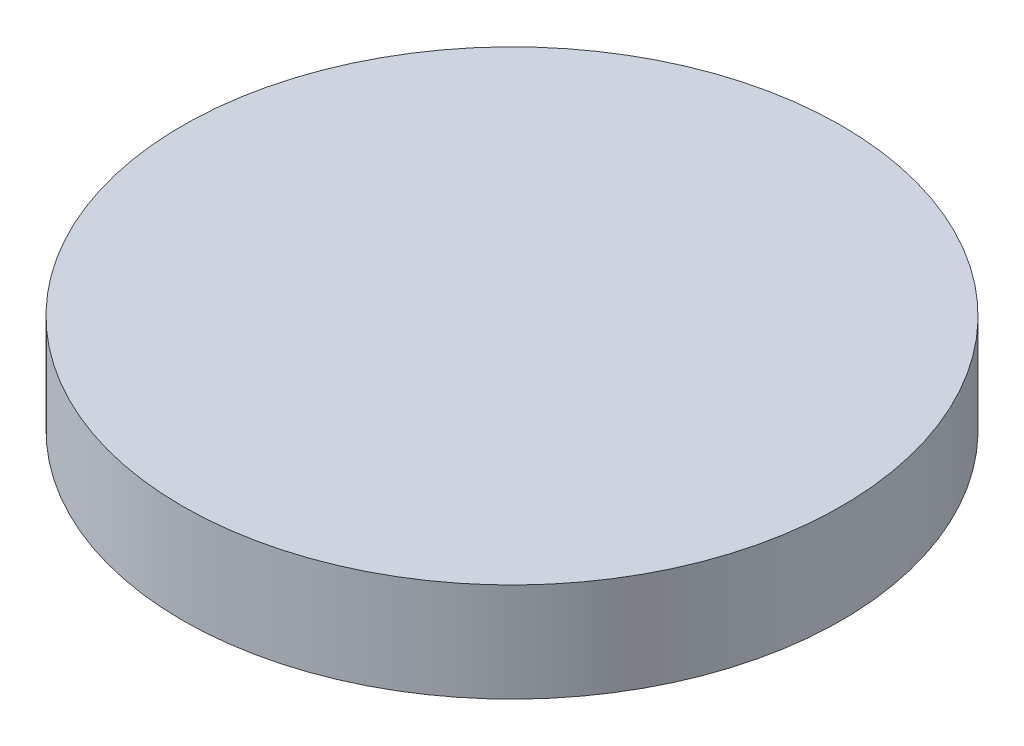
ISO-10303-21;
HEADER;
FILE_DESCRIPTION(('STEP AP214'),'2;1');
FILE_NAME('part.step','',(''),(''),'','','');
FILE_SCHEMA(('AUTOMOTIVE_DESIGN { 1 0 10303 214 1 1 1 1 }'));
ENDSEC;
DATA;
#1=APPLICATION_CONTEXT('core data for automotive mechanical design processes');
#2=APPLICATION_PROTOCOL_DEFINITION('international standard','automotive_design',2000,#1);
#3=PRODUCT_CONTEXT('',#1,'mechanical');
#4=PRODUCT('Part','Part','',(#3));
#5=PRODUCT_RELATED_PRODUCT_CATEGORY('part','',(#4));
#6=PRODUCT_DEFINITION_FORMATION('','',#4);
#7=PRODUCT_DEFINITION_CONTEXT('part definition',#1,'design');
#8=PRODUCT_DEFINITION('design','',#6,#7);
#9=PRODUCT_DEFINITION_SHAPE('','',#8);
#10=(LENGTH_UNIT() NAMED_UNIT(*) SI_UNIT(.MILLI.,.METRE.));
#11=(NAMED_UNIT(*) PLANE_ANGLE_UNIT() SI_UNIT($,.RADIAN.));
#12=(NAMED_UNIT(*) SI_UNIT($,.STERADIAN.) SOLID_ANGLE_UNIT());
#13=UNCERTAINTY_MEASURE_WITH_UNIT(LENGTH_MEASURE(1.E-05),#10,'distance_accuracy_value','');
#14=(GEOMETRIC_REPRESENTATION_CONTEXT(3) GLOBAL_UNCERTAINTY_ASSIGNED_CONTEXT((#13)) GLOBAL_UNIT_ASSIGNED_CONTEXT((#10,
#11,#12)) REPRESENTATION_CONTEXT('',''));
#15=CARTESIAN_POINT('',(0.,0.,0.));
#16=DIRECTION('',(0.,0.,1.));
#17=DIRECTION('',(1.,0.,0.));
#18=AXIS2_PLACEMENT_3D('',#15,#16,#17);
#19=CARTESIAN_POINT('',(0.,3.,0.));
#20=DIRECTION('',(0.,-1.,0.));
#21=DIRECTION('',(0.,0.,-1.));
#22=AXIS2_PLACEMENT_3D('',#19,#20,#21);
#23=CYLINDRICAL_SURFACE('',#22,10.);
#24=CARTESIAN_POINT('',(0.,3.,0.));
#25=DIRECTION('',(0.,1.,0.));
#26=DIRECTION('',(0.,0.,1.));
#27=AXIS2_PLACEMENT_3D('',#24,#25,#26);
#28=CIRCLE('',#27,10.);
#29=CARTESIAN_POINT('',(0.,3.,10.));
#30=VERTEX_POINT('',#29);
#31=EDGE_CURVE('E10',#30,#30,#28,.T.);
#32=ORIENTED_EDGE('',*,*,#31,.F.);
#33=EDGE_LOOP('',(#32));
#34=FACE_BOUND('',#33,.T.);
#35=CARTESIAN_POINT('',(0.,0.,0.));
#36=DIRECTION('',(0.,1.,0.));
#37=DIRECTION('',(0.,0.,1.));
#38=AXIS2_PLACEMENT_3D('',#35,#36,#37);
#39=CIRCLE('',#38,10.);
#40=CARTESIAN_POINT('',(0.,0.,10.));
#41=VERTEX_POINT('',#40);
#42=EDGE_CURVE('E44',#41,#41,#39,.T.);
#43=ORIENTED_EDGE('',*,*,#42,.T.);
#44=EDGE_LOOP('',(#43));
#45=FACE_BOUND('',#44,.T.);
#46=ADVANCED_FACE('F41',(#34,#45),#23,.T.);
#47=CARTESIAN_POINT('',(0.,3.,0.));
#48=DIRECTION('',(0.,1.,0.));
#49=DIRECTION('',(0.,0.,1.));
#50=AXIS2_PLACEMENT_3D('',#47,#48,#49);
#51=PLANE('',#50);
#52=ORIENTED_EDGE('',*,*,#31,.T.);
#53=EDGE_LOOP('',(#52));
#54=FACE_BOUND('',#53,.T.);
#55=ADVANCED_FACE('F58',(#54),#51,.T.);
#56=CARTESIAN_POINT('',(0.,0.,0.));
#57=DIRECTION('',(0.,1.,0.));
#58=DIRECTION('',(0.,0.,1.));
#59=AXIS2_PLACEMENT_3D('',#56,#57,#58);
#60=PLANE('',#59);
#61=ORIENTED_EDGE('',*,*,#42,.F.);
#62=EDGE_LOOP('',(#61));
#63=FACE_BOUND('',#62,.T.);
#64=ADVANCED_FACE('F56',(#63),#60,.F.);
#65=CLOSED_SHELL('',(#46,#55,#64));
#66=MANIFOLD_SOLID_BREP('B2',#65);
#67=ADVANCED_BREP_SHAPE_REPRESENTATION('',(#18,#66),#14);
#68=SHAPE_DEFINITION_REPRESENTATION(#9,#67);
ENDSEC;
END-ISO-10303-21;
